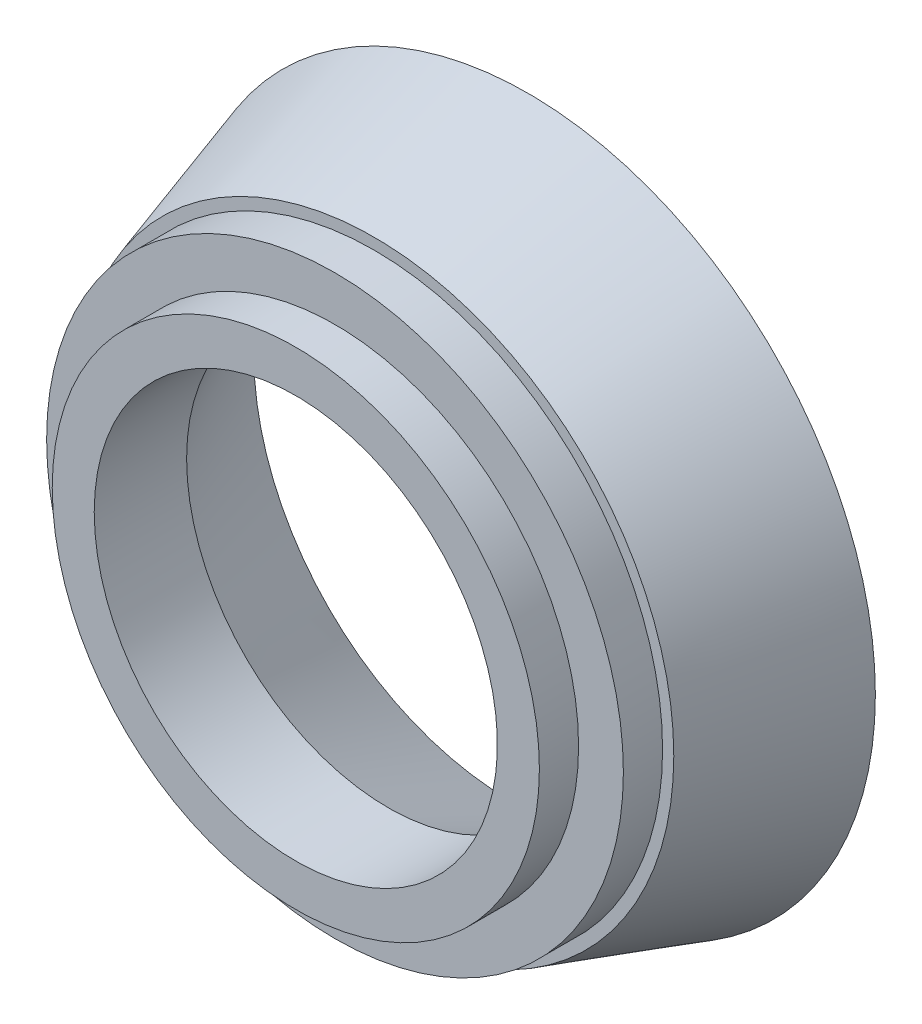
ISO-10303-21;
HEADER;
FILE_DESCRIPTION(('STEP AP214'),'2;1');
FILE_NAME('part.step','',(''),(''),'','','');
FILE_SCHEMA(('AUTOMOTIVE_DESIGN { 1 0 10303 214 1 1 1 1 }'));
ENDSEC;
DATA;
#1=APPLICATION_CONTEXT('core data for automotive mechanical design processes');
#2=APPLICATION_PROTOCOL_DEFINITION('international standard','automotive_design',2000,#1);
#3=PRODUCT_CONTEXT('',#1,'mechanical');
#4=PRODUCT('Part','Part','',(#3));
#5=PRODUCT_RELATED_PRODUCT_CATEGORY('part','',(#4));
#6=PRODUCT_DEFINITION_FORMATION('','',#4);
#7=PRODUCT_DEFINITION_CONTEXT('part definition',#1,'design');
#8=PRODUCT_DEFINITION('design','',#6,#7);
#9=PRODUCT_DEFINITION_SHAPE('','',#8);
#10=(LENGTH_UNIT() NAMED_UNIT(*) SI_UNIT(.MILLI.,.METRE.));
#11=(NAMED_UNIT(*) PLANE_ANGLE_UNIT() SI_UNIT($,.RADIAN.));
#12=(NAMED_UNIT(*) SI_UNIT($,.STERADIAN.) SOLID_ANGLE_UNIT());
#13=UNCERTAINTY_MEASURE_WITH_UNIT(LENGTH_MEASURE(1.E-05),#10,'distance_accuracy_value','');
#14=(GEOMETRIC_REPRESENTATION_CONTEXT(3) GLOBAL_UNCERTAINTY_ASSIGNED_CONTEXT((#13)) GLOBAL_UNIT_ASSIGNED_CONTEXT((#10,
#11,#12)) REPRESENTATION_CONTEXT('',''));
#15=CARTESIAN_POINT('',(0.,0.,0.));
#16=DIRECTION('',(0.,0.,1.));
#17=DIRECTION('',(1.,0.,0.));
#18=AXIS2_PLACEMENT_3D('',#15,#16,#17);
#19=CARTESIAN_POINT('',(0.,0.,34.5));
#20=DIRECTION('',(0.,0.,1.));
#21=DIRECTION('',(1.,0.,0.));
#22=AXIS2_PLACEMENT_3D('',#19,#20,#21);
#23=PLANE('',#22);
#24=CARTESIAN_POINT('',(0.,0.,34.5));
#25=DIRECTION('',(0.,0.,1.));
#26=DIRECTION('',(1.,0.,0.));
#27=AXIS2_PLACEMENT_3D('',#24,#25,#26);
#28=CIRCLE('',#27,51.5);
#29=CARTESIAN_POINT('',(51.5,0.,34.5));
#30=VERTEX_POINT('',#29);
#31=EDGE_CURVE('E52',#30,#30,#28,.T.);
#32=ORIENTED_EDGE('',*,*,#31,.T.);
#33=EDGE_LOOP('',(#32));
#34=FACE_BOUND('',#33,.T.);
#35=CARTESIAN_POINT('',(0.,0.,34.5));
#36=DIRECTION('',(0.,0.,1.));
#37=DIRECTION('',(1.,0.,0.));
#38=AXIS2_PLACEMENT_3D('',#35,#36,#37);
#39=CIRCLE('',#38,43.5);
#40=CARTESIAN_POINT('',(43.5,0.,34.5));
#41=VERTEX_POINT('',#40);
#42=EDGE_CURVE('E151',#41,#41,#39,.T.);
#43=ORIENTED_EDGE('',*,*,#42,.F.);
#44=EDGE_LOOP('',(#43));
#45=FACE_BOUND('',#44,.T.);
#46=ADVANCED_FACE('F37',(#34,#45),#23,.T.);
#47=CARTESIAN_POINT('',(0.,0.,27.5));
#48=DIRECTION('',(0.,0.,1.));
#49=DIRECTION('',(1.,0.,0.));
#50=AXIS2_PLACEMENT_3D('',#47,#48,#49);
#51=PLANE('',#50);
#52=CARTESIAN_POINT('',(0.,0.,27.5));
#53=DIRECTION('',(0.,0.,1.));
#54=DIRECTION('',(1.,0.,0.));
#55=AXIS2_PLACEMENT_3D('',#52,#53,#54);
#56=CIRCLE('',#55,53.5);
#57=CARTESIAN_POINT('',(53.5,0.,27.5));
#58=VERTEX_POINT('',#57);
#59=EDGE_CURVE('E46',#58,#58,#56,.T.);
#60=ORIENTED_EDGE('',*,*,#59,.T.);
#61=EDGE_LOOP('',(#60));
#62=FACE_BOUND('',#61,.T.);
#63=CARTESIAN_POINT('',(0.,0.,27.5));
#64=DIRECTION('',(0.,0.,1.));
#65=DIRECTION('',(1.,0.,0.));
#66=AXIS2_PLACEMENT_3D('',#63,#64,#65);
#67=CIRCLE('',#66,51.5);
#68=CARTESIAN_POINT('',(51.5,0.,27.5));
#69=VERTEX_POINT('',#68);
#70=EDGE_CURVE('E145',#69,#69,#67,.T.);
#71=ORIENTED_EDGE('',*,*,#70,.F.);
#72=EDGE_LOOP('',(#71));
#73=FACE_BOUND('',#72,.T.);
#74=ADVANCED_FACE('F39',(#62,#73),#51,.T.);
#75=CARTESIAN_POINT('',(0.,0.,0.));
#76=DIRECTION('',(0.,0.,1.));
#77=DIRECTION('',(1.,0.,0.));
#78=AXIS2_PLACEMENT_3D('',#75,#76,#77);
#79=PLANE('',#78);
#80=CARTESIAN_POINT('',(0.,0.,0.));
#81=DIRECTION('',(0.,0.,-1.));
#82=DIRECTION('',(-1.,0.,0.));
#83=AXIS2_PLACEMENT_3D('',#80,#81,#82);
#84=CIRCLE('',#83,59.5);
#85=CARTESIAN_POINT('',(-59.5,0.,0.));
#86=VERTEX_POINT('',#85);
#87=EDGE_CURVE('E157',#86,#86,#84,.T.);
#88=ORIENTED_EDGE('',*,*,#87,.F.);
#89=EDGE_LOOP('',(#88));
#90=FACE_BOUND('',#89,.T.);
#91=CARTESIAN_POINT('',(0.,0.,0.));
#92=DIRECTION('',(0.,0.,1.));
#93=DIRECTION('',(1.,0.,0.));
#94=AXIS2_PLACEMENT_3D('',#91,#92,#93);
#95=CIRCLE('',#94,62.);
#96=CARTESIAN_POINT('',(62.,0.,0.));
#97=VERTEX_POINT('',#96);
#98=EDGE_CURVE('E11',#97,#97,#95,.T.);
#99=ORIENTED_EDGE('',*,*,#98,.F.);
#100=EDGE_LOOP('',(#99));
#101=FACE_BOUND('',#100,.T.);
#102=ADVANCED_FACE('F118',(#90,#101),#79,.F.);
#103=CARTESIAN_POINT('',(0.,0.,27.5));
#104=DIRECTION('',(0.,0.,-1.));
#105=DIRECTION('',(-1.,0.,0.));
#106=AXIS2_PLACEMENT_3D('',#103,#104,#105);
#107=CONICAL_SURFACE('',#106,53.5,0.29977607009998);
#108=ORIENTED_EDGE('',*,*,#98,.T.);
#109=EDGE_LOOP('',(#108));
#110=FACE_BOUND('',#109,.T.);
#111=ORIENTED_EDGE('',*,*,#59,.F.);
#112=EDGE_LOOP('',(#111));
#113=FACE_BOUND('',#112,.T.);
#114=ADVANCED_FACE('F116',(#110,#113),#107,.T.);
#115=CARTESIAN_POINT('',(0.,0.,34.5));
#116=DIRECTION('',(0.,0.,-1.));
#117=DIRECTION('',(-1.,0.,0.));
#118=AXIS2_PLACEMENT_3D('',#115,#116,#117);
#119=CYLINDRICAL_SURFACE('',#118,51.5);
#120=ORIENTED_EDGE('',*,*,#31,.F.);
#121=EDGE_LOOP('',(#120));
#122=FACE_BOUND('',#121,.T.);
#123=ORIENTED_EDGE('',*,*,#70,.T.);
#124=EDGE_LOOP('',(#123));
#125=FACE_BOUND('',#124,.T.);
#126=ADVANCED_FACE('F110',(#122,#125),#119,.T.);
#127=CARTESIAN_POINT('',(0.,0.,41.5));
#128=DIRECTION('',(0.,0.,-1.));
#129=DIRECTION('',(-1.,0.,0.));
#130=AXIS2_PLACEMENT_3D('',#127,#128,#129);
#131=CYLINDRICAL_SURFACE('',#130,43.5);
#132=CARTESIAN_POINT('',(0.,0.,41.5));
#133=DIRECTION('',(0.,0.,1.));
#134=DIRECTION('',(1.,0.,0.));
#135=AXIS2_PLACEMENT_3D('',#132,#133,#134);
#136=CIRCLE('',#135,43.5);
#137=CARTESIAN_POINT('',(43.5,0.,41.5));
#138=VERTEX_POINT('',#137);
#139=EDGE_CURVE('E148',#138,#138,#136,.T.);
#140=ORIENTED_EDGE('',*,*,#139,.F.);
#141=EDGE_LOOP('',(#140));
#142=FACE_BOUND('',#141,.T.);
#143=ORIENTED_EDGE('',*,*,#42,.T.);
#144=EDGE_LOOP('',(#143));
#145=FACE_BOUND('',#144,.T.);
#146=ADVANCED_FACE('F106',(#142,#145),#131,.T.);
#147=CARTESIAN_POINT('',(0.,0.,41.5));
#148=DIRECTION('',(0.,0.,1.));
#149=DIRECTION('',(1.,0.,0.));
#150=AXIS2_PLACEMENT_3D('',#147,#148,#149);
#151=PLANE('',#150);
#152=CARTESIAN_POINT('',(0.,0.,41.5));
#153=DIRECTION('',(0.,0.,-1.));
#154=DIRECTION('',(-1.,0.,0.));
#155=AXIS2_PLACEMENT_3D('',#152,#153,#154);
#156=CIRCLE('',#155,36.);
#157=CARTESIAN_POINT('',(-36.,0.,41.5));
#158=VERTEX_POINT('',#157);
#159=EDGE_CURVE('E165',#158,#158,#156,.T.);
#160=ORIENTED_EDGE('',*,*,#159,.T.);
#161=EDGE_LOOP('',(#160));
#162=FACE_BOUND('',#161,.T.);
#163=ORIENTED_EDGE('',*,*,#139,.T.);
#164=EDGE_LOOP('',(#163));
#165=FACE_BOUND('',#164,.T.);
#166=ADVANCED_FACE('F102',(#162,#165),#151,.T.);
#167=CARTESIAN_POINT('',(0.,0.,3.));
#168=DIRECTION('',(0.,0.,-1.));
#169=DIRECTION('',(-1.,0.,0.));
#170=AXIS2_PLACEMENT_3D('',#167,#168,#169);
#171=CYLINDRICAL_SURFACE('',#170,59.5);
#172=CARTESIAN_POINT('',(0.,0.,3.));
#173=DIRECTION('',(0.,0.,-1.));
#174=DIRECTION('',(-1.,0.,0.));
#175=AXIS2_PLACEMENT_3D('',#172,#173,#174);
#176=CIRCLE('',#175,59.5);
#177=CARTESIAN_POINT('',(-59.5,0.,3.));
#178=VERTEX_POINT('',#177);
#179=EDGE_CURVE('E154',#178,#178,#176,.T.);
#180=ORIENTED_EDGE('',*,*,#179,.F.);
#181=EDGE_LOOP('',(#180));
#182=FACE_BOUND('',#181,.T.);
#183=ORIENTED_EDGE('',*,*,#87,.T.);
#184=EDGE_LOOP('',(#183));
#185=FACE_BOUND('',#184,.T.);
#186=ADVANCED_FACE('F97',(#182,#185),#171,.F.);
#187=CARTESIAN_POINT('',(0.,0.,3.));
#188=DIRECTION('',(0.,0.,-1.));
#189=DIRECTION('',(-1.,0.,0.));
#190=AXIS2_PLACEMENT_3D('',#187,#188,#189);
#191=PLANE('',#190);
#192=CARTESIAN_POINT('',(0.,0.,3.));
#193=DIRECTION('',(0.,0.,-1.));
#194=DIRECTION('',(-1.,0.,0.));
#195=AXIS2_PLACEMENT_3D('',#192,#193,#194);
#196=CIRCLE('',#195,46.);
#197=CARTESIAN_POINT('',(-46.,0.,3.));
#198=VERTEX_POINT('',#197);
#199=EDGE_CURVE('E79',#198,#198,#196,.T.);
#200=ORIENTED_EDGE('',*,*,#199,.F.);
#201=EDGE_LOOP('',(#200));
#202=FACE_BOUND('',#201,.T.);
#203=ORIENTED_EDGE('',*,*,#179,.T.);
#204=EDGE_LOOP('',(#203));
#205=FACE_BOUND('',#204,.T.);
#206=ADVANCED_FACE('F86',(#202,#205),#191,.T.);
#207=CARTESIAN_POINT('',(0.,0.,25.));
#208=DIRECTION('',(0.,0.,-1.));
#209=DIRECTION('',(-1.,0.,0.));
#210=AXIS2_PLACEMENT_3D('',#207,#208,#209);
#211=CONICAL_SURFACE('',#210,36.,0.426627493126876);
#212=ORIENTED_EDGE('',*,*,#199,.T.);
#213=EDGE_LOOP('',(#212));
#214=FACE_BOUND('',#213,.T.);
#215=CARTESIAN_POINT('',(0.,0.,25.));
#216=DIRECTION('',(0.,0.,-1.));
#217=DIRECTION('',(-1.,0.,0.));
#218=AXIS2_PLACEMENT_3D('',#215,#216,#217);
#219=CIRCLE('',#218,36.);
#220=CARTESIAN_POINT('',(-36.,0.,25.));
#221=VERTEX_POINT('',#220);
#222=EDGE_CURVE('E177',#221,#221,#219,.T.);
#223=ORIENTED_EDGE('',*,*,#222,.F.);
#224=EDGE_LOOP('',(#223));
#225=FACE_BOUND('',#224,.T.);
#226=ADVANCED_FACE('F96',(#214,#225),#211,.F.);
#227=CARTESIAN_POINT('',(0.,0.,41.5));
#228=DIRECTION('',(0.,0.,-1.));
#229=DIRECTION('',(-1.,0.,0.));
#230=AXIS2_PLACEMENT_3D('',#227,#228,#229);
#231=CYLINDRICAL_SURFACE('',#230,36.);
#232=ORIENTED_EDGE('',*,*,#159,.F.);
#233=EDGE_LOOP('',(#232));
#234=FACE_BOUND('',#233,.T.);
#235=ORIENTED_EDGE('',*,*,#222,.T.);
#236=EDGE_LOOP('',(#235));
#237=FACE_BOUND('',#236,.T.);
#238=ADVANCED_FACE('F193',(#234,#237),#231,.F.);
#239=CLOSED_SHELL('',(#46,#74,#102,#114,#126,#146,#166,#186,#206,#226,#238));
#240=MANIFOLD_SOLID_BREP('B2',#239);
#241=ADVANCED_BREP_SHAPE_REPRESENTATION('',(#18,#240),#14);
#242=SHAPE_DEFINITION_REPRESENTATION(#9,#241);
ENDSEC;
END-ISO-10303-21;
